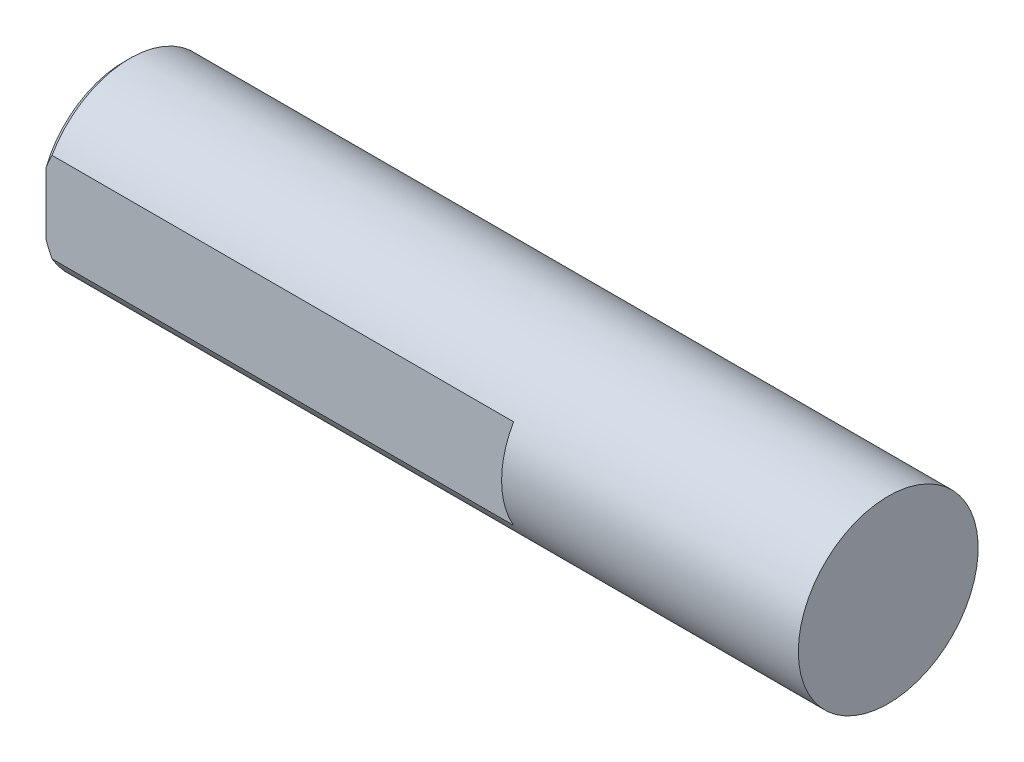
ISO-10303-21;
HEADER;
FILE_DESCRIPTION(('STEP AP214'),'2;1');
FILE_NAME('part.step','',(''),(''),'','','');
FILE_SCHEMA(('AUTOMOTIVE_DESIGN { 1 0 10303 214 1 1 1 1 }'));
ENDSEC;
DATA;
#1=APPLICATION_CONTEXT('core data for automotive mechanical design processes');
#2=APPLICATION_PROTOCOL_DEFINITION('international standard','automotive_design',2000,#1);
#3=PRODUCT_CONTEXT('',#1,'mechanical');
#4=PRODUCT('Part','Part','',(#3));
#5=PRODUCT_RELATED_PRODUCT_CATEGORY('part','',(#4));
#6=PRODUCT_DEFINITION_FORMATION('','',#4);
#7=PRODUCT_DEFINITION_CONTEXT('part definition',#1,'design');
#8=PRODUCT_DEFINITION('design','',#6,#7);
#9=PRODUCT_DEFINITION_SHAPE('','',#8);
#10=(LENGTH_UNIT() NAMED_UNIT(*) SI_UNIT(.MILLI.,.METRE.));
#11=(NAMED_UNIT(*) PLANE_ANGLE_UNIT() SI_UNIT($,.RADIAN.));
#12=(NAMED_UNIT(*) SI_UNIT($,.STERADIAN.) SOLID_ANGLE_UNIT());
#13=UNCERTAINTY_MEASURE_WITH_UNIT(LENGTH_MEASURE(1.E-05),#10,'distance_accuracy_value','');
#14=(GEOMETRIC_REPRESENTATION_CONTEXT(3) GLOBAL_UNCERTAINTY_ASSIGNED_CONTEXT((#13)) GLOBAL_UNIT_ASSIGNED_CONTEXT((#10,
#11,#12)) REPRESENTATION_CONTEXT('',''));
#15=CARTESIAN_POINT('',(0.,0.,0.));
#16=DIRECTION('',(0.,0.,1.));
#17=DIRECTION('',(1.,0.,0.));
#18=AXIS2_PLACEMENT_3D('',#15,#16,#17);
#19=CARTESIAN_POINT('',(-11.75,0.,0.));
#20=DIRECTION('',(-1.,0.,0.));
#21=DIRECTION('',(0.,0.,1.));
#22=AXIS2_PLACEMENT_3D('',#19,#20,#21);
#23=PLANE('',#22);
#24=DIRECTION('',(0.,1.,0.));
#25=VECTOR('',#24,1.);
#26=CARTESIAN_POINT('',(-11.75,0.,1.3));
#27=LINE('',#26,#25);
#28=CARTESIAN_POINT('',(-11.750000000033,0.519615242170956,1.3));
#29=VERTEX_POINT('',#28);
#30=CARTESIAN_POINT('',(-11.7500000000316,-0.519615242174728,1.3));
#31=VERTEX_POINT('',#30);
#32=EDGE_CURVE('E68',#29,#31,#27,.F.);
#33=ORIENTED_EDGE('',*,*,#32,.F.);
#34=CARTESIAN_POINT('',(-11.7500000000632,0.,0.));
#35=DIRECTION('',(1.,0.,0.));
#36=DIRECTION('',(0.,0.,-1.));
#37=AXIS2_PLACEMENT_3D('',#34,#35,#36);
#38=CIRCLE('',#37,1.39999999993279);
#39=EDGE_CURVE('E54',#31,#29,#38,.T.);
#40=ORIENTED_EDGE('',*,*,#39,.F.);
#41=EDGE_LOOP('',(#33,#40));
#42=FACE_BOUND('',#41,.T.);
#43=ADVANCED_FACE('F17',(#42),#23,.T.);
#44=CARTESIAN_POINT('',(1.,0.,0.));
#45=DIRECTION('',(1.,0.,0.));
#46=DIRECTION('',(0.,0.,-1.));
#47=AXIS2_PLACEMENT_3D('',#44,#45,#46);
#48=PLANE('',#47);
#49=CARTESIAN_POINT('',(1.,0.,0.));
#50=DIRECTION('',(-1.,0.,0.));
#51=DIRECTION('',(0.,0.,1.));
#52=AXIS2_PLACEMENT_3D('',#49,#50,#51);
#53=CIRCLE('',#52,1.5);
#54=CARTESIAN_POINT('',(1.,0.,1.5));
#55=VERTEX_POINT('',#54);
#56=EDGE_CURVE('E78',#55,#55,#53,.T.);
#57=ORIENTED_EDGE('',*,*,#56,.F.);
#58=EDGE_LOOP('',(#57));
#59=FACE_BOUND('',#58,.T.);
#60=ADVANCED_FACE('F92',(#59),#48,.T.);
#61=CARTESIAN_POINT('',(-3.95,0.,1.4));
#62=DIRECTION('',(-1.,0.,0.));
#63=DIRECTION('',(0.,0.,1.));
#64=AXIS2_PLACEMENT_3D('',#61,#62,#63);
#65=PLANE('',#64);
#66=DIRECTION('',(0.,1.,0.));
#67=VECTOR('',#66,1.);
#68=CARTESIAN_POINT('',(-3.95,0.,1.3));
#69=LINE('',#68,#67);
#70=CARTESIAN_POINT('',(-3.95,-0.748331477354788,1.3));
#71=VERTEX_POINT('',#70);
#72=CARTESIAN_POINT('',(-3.95,0.748331477354789,1.3));
#73=VERTEX_POINT('',#72);
#74=EDGE_CURVE('E67',#71,#73,#69,.T.);
#75=ORIENTED_EDGE('',*,*,#74,.F.);
#76=CARTESIAN_POINT('',(-3.95,0.,0.));
#77=DIRECTION('',(-1.,0.,0.));
#78=DIRECTION('',(0.,0.,1.));
#79=AXIS2_PLACEMENT_3D('',#76,#77,#78);
#80=CIRCLE('',#79,1.5);
#81=EDGE_CURVE('E75',#73,#71,#80,.F.);
#82=ORIENTED_EDGE('',*,*,#81,.F.);
#83=EDGE_LOOP('',(#75,#82));
#84=FACE_BOUND('',#83,.T.);
#85=ADVANCED_FACE('F89',(#84),#65,.T.);
#86=CARTESIAN_POINT('',(-7.85,0.,1.3));
#87=DIRECTION('',(0.,0.,1.));
#88=DIRECTION('',(1.,0.,0.));
#89=AXIS2_PLACEMENT_3D('',#86,#87,#88);
#90=PLANE('',#89);
#91=DIRECTION('',(-1.,0.,0.));
#92=VECTOR('',#91,1.);
#93=CARTESIAN_POINT('',(-5.375,-0.748331477354789,1.3));
#94=LINE('',#93,#92);
#95=CARTESIAN_POINT('',(-11.6500000000005,-0.748331477349861,1.3));
#96=VERTEX_POINT('',#95);
#97=EDGE_CURVE('E31',#71,#96,#94,.T.);
#98=ORIENTED_EDGE('',*,*,#97,.F.);
#99=ORIENTED_EDGE('',*,*,#74,.T.);
#100=DIRECTION('',(1.,0.,0.));
#101=VECTOR('',#100,1.);
#102=CARTESIAN_POINT('',(-7.85,0.748331477354789,1.3));
#103=LINE('',#102,#101);
#104=CARTESIAN_POINT('',(-11.6500000000001,0.748331477350647,1.3));
#105=VERTEX_POINT('',#104);
#106=EDGE_CURVE('E62',#73,#105,#103,.F.);
#107=ORIENTED_EDGE('',*,*,#106,.T.);
#108=CARTESIAN_POINT('',(-11.7499999999978,0.519615242250495,1.29999999998837));
#109=CARTESIAN_POINT('',(-11.7427547242484,0.539135120215964,1.2999999999958));
#110=CARTESIAN_POINT('',(-11.7352013244963,0.558538916477449,1.29999999999887));
#111=CARTESIAN_POINT('',(-11.7195374537189,0.597104377330161,1.30000000000113));
#112=CARTESIAN_POINT('',(-11.7114273866157,0.616266205788079,1.30000000000032));
#113=CARTESIAN_POINT('',(-11.6946994741102,0.654364246451235,1.29999999999968));
#114=CARTESIAN_POINT('',(-11.6860816697862,0.673300476759852,1.29999999999984));
#115=CARTESIAN_POINT('',(-11.6683785480491,0.710969948627782,1.30000000000016));
#116=CARTESIAN_POINT('',(-11.6592928991893,0.729703034570292,1.30000000000032));
#117=CARTESIAN_POINT('',(-11.6500000000001,0.748331477346505,1.3));
#118=B_SPLINE_CURVE_WITH_KNOTS('',3,(#108,#109,#110,#111,#112,#113,#114,#115,#116,#117),
.UNSPECIFIED.,.F.,.F.,(4,2,2,2,4),(0.,0.0624584960353892,0.124872141251948,0.187280743814683,
0.249734185252055),.UNSPECIFIED.);
#119=EDGE_CURVE('E20',#29,#105,#118,.T.);
#120=ORIENTED_EDGE('',*,*,#119,.F.);
#121=ORIENTED_EDGE('',*,*,#32,.T.);
#122=CARTESIAN_POINT('',(-11.6500000000009,-0.748331477344934,1.3));
#123=CARTESIAN_POINT('',(-11.6592928991898,-0.729703034568823,1.3));
#124=CARTESIAN_POINT('',(-11.6683785480496,-0.710969948626497,1.3));
#125=CARTESIAN_POINT('',(-11.6860816697867,-0.673300476758915,1.3));
#126=CARTESIAN_POINT('',(-11.6946994741107,-0.654364246450463,1.3));
#127=CARTESIAN_POINT('',(-11.7114273866158,-0.616266205787515,1.3));
#128=CARTESIAN_POINT('',(-11.7195374537185,-0.59710437732964,1.3));
#129=CARTESIAN_POINT('',(-11.7352013244968,-0.558538916477683,1.3));
#130=CARTESIAN_POINT('',(-11.7427547242501,-0.539135120216909,1.3));
#131=CARTESIAN_POINT('',(-11.7500000000026,-0.519615242252874,1.3));
#132=B_SPLINE_CURVE_WITH_KNOTS('',3,(#122,#123,#124,#125,#126,#127,#128,#129,#130,#131),
.UNSPECIFIED.,.F.,.F.,(4,2,2,2,4),(0.,0.0624534414368317,0.124862043999098,0.187275689215078,
0.249734185249808),.UNSPECIFIED.);
#133=EDGE_CURVE('E40',#96,#31,#132,.T.);
#134=ORIENTED_EDGE('',*,*,#133,.F.);
#135=EDGE_LOOP('',(#98,#99,#107,#120,#121,#134));
#136=FACE_BOUND('',#135,.T.);
#137=ADVANCED_FACE('F66',(#136),#90,.T.);
#138=CARTESIAN_POINT('',(-11.6500000000883,0.,0.));
#139=DIRECTION('',(1.,0.,0.));
#140=DIRECTION('',(0.,0.,-1.));
#141=AXIS2_PLACEMENT_3D('',#138,#139,#140);
#142=CONICAL_SURFACE('',#141,1.49999999990769,0.785398163397448);
#143=ORIENTED_EDGE('',*,*,#133,.T.);
#144=ORIENTED_EDGE('',*,*,#39,.T.);
#145=ORIENTED_EDGE('',*,*,#119,.T.);
#146=CARTESIAN_POINT('',(-11.65,0.,0.));
#147=DIRECTION('',(-1.,0.,0.));
#148=DIRECTION('',(0.,0.,1.));
#149=AXIS2_PLACEMENT_3D('',#146,#147,#148);
#150=CIRCLE('',#149,1.5);
#151=EDGE_CURVE('E11',#96,#105,#150,.F.);
#152=ORIENTED_EDGE('',*,*,#151,.F.);
#153=EDGE_LOOP('',(#143,#144,#145,#152));
#154=FACE_BOUND('',#153,.T.);
#155=ADVANCED_FACE('F64',(#154),#142,.T.);
#156=CARTESIAN_POINT('',(-5.375,0.,0.));
#157=DIRECTION('',(-1.,0.,0.));
#158=DIRECTION('',(0.,0.,1.));
#159=AXIS2_PLACEMENT_3D('',#156,#157,#158);
#160=CYLINDRICAL_SURFACE('',#159,1.5);
#161=ORIENTED_EDGE('',*,*,#56,.T.);
#162=EDGE_LOOP('',(#161));
#163=FACE_BOUND('',#162,.T.);
#164=ORIENTED_EDGE('',*,*,#97,.T.);
#165=ORIENTED_EDGE('',*,*,#151,.T.);
#166=ORIENTED_EDGE('',*,*,#106,.F.);
#167=ORIENTED_EDGE('',*,*,#81,.T.);
#168=EDGE_LOOP('',(#164,#165,#166,#167));
#169=FACE_BOUND('',#168,.T.);
#170=ADVANCED_FACE('F59',(#163,#169),#160,.T.);
#171=CLOSED_SHELL('',(#43,#60,#85,#137,#155,#170));
#172=MANIFOLD_SOLID_BREP('B1',#171);
#173=ADVANCED_BREP_SHAPE_REPRESENTATION('',(#18,#172),#14);
#174=SHAPE_DEFINITION_REPRESENTATION(#9,#173);
ENDSEC;
END-ISO-10303-21;
